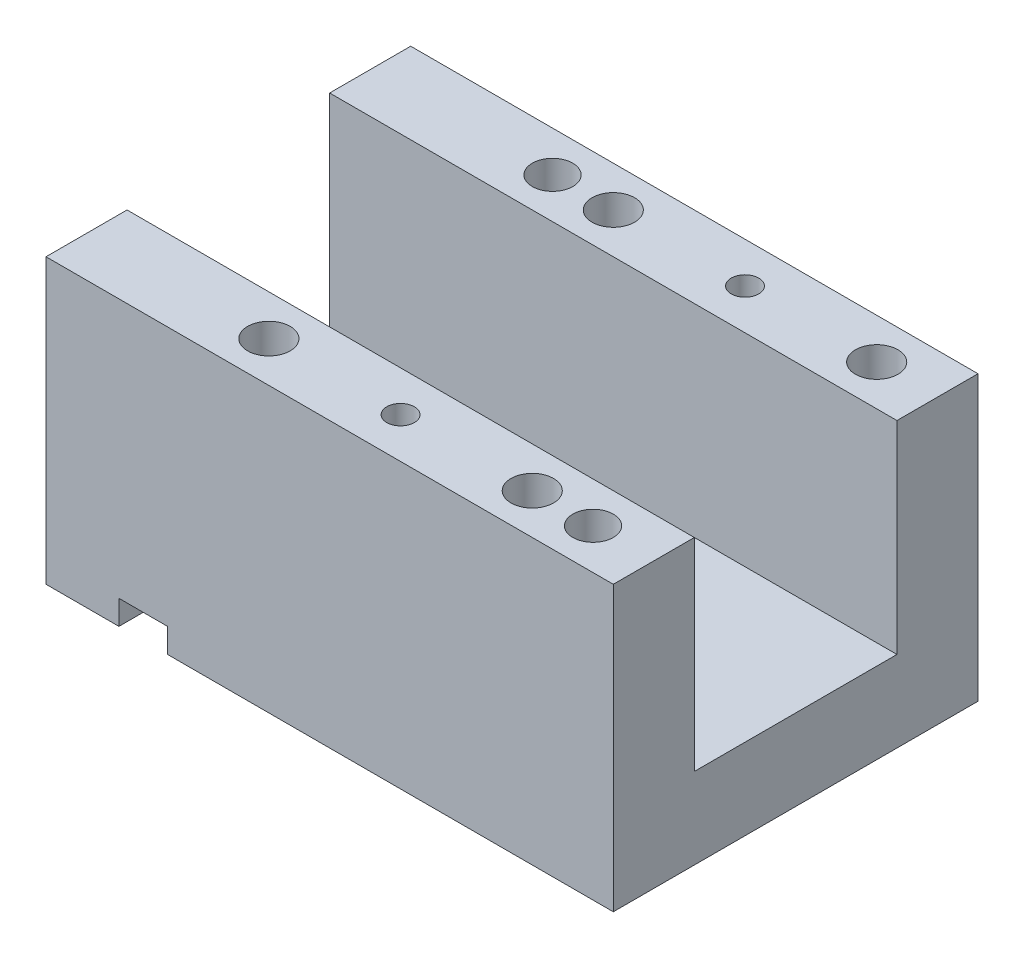
ISO-10303-21;
HEADER;
FILE_DESCRIPTION(('STEP AP214'),'2;1');
FILE_NAME('part.step','',(''),(''),'','','');
FILE_SCHEMA(('AUTOMOTIVE_DESIGN { 1 0 10303 214 1 1 1 1 }'));
ENDSEC;
DATA;
#1=APPLICATION_CONTEXT('core data for automotive mechanical design processes');
#2=APPLICATION_PROTOCOL_DEFINITION('international standard','automotive_design',2000,#1);
#3=PRODUCT_CONTEXT('',#1,'mechanical');
#4=PRODUCT('Part','Part','',(#3));
#5=PRODUCT_RELATED_PRODUCT_CATEGORY('part','',(#4));
#6=PRODUCT_DEFINITION_FORMATION('','',#4);
#7=PRODUCT_DEFINITION_CONTEXT('part definition',#1,'design');
#8=PRODUCT_DEFINITION('design','',#6,#7);
#9=PRODUCT_DEFINITION_SHAPE('','',#8);
#10=(LENGTH_UNIT() NAMED_UNIT(*) SI_UNIT(.MILLI.,.METRE.));
#11=(NAMED_UNIT(*) PLANE_ANGLE_UNIT() SI_UNIT($,.RADIAN.));
#12=(NAMED_UNIT(*) SI_UNIT($,.STERADIAN.) SOLID_ANGLE_UNIT());
#13=UNCERTAINTY_MEASURE_WITH_UNIT(LENGTH_MEASURE(1.E-05),#10,'distance_accuracy_value','');
#14=(GEOMETRIC_REPRESENTATION_CONTEXT(3) GLOBAL_UNCERTAINTY_ASSIGNED_CONTEXT((#13)) GLOBAL_UNIT_ASSIGNED_CONTEXT((#10,
#11,#12)) REPRESENTATION_CONTEXT('',''));
#15=CARTESIAN_POINT('',(0.,0.,0.));
#16=DIRECTION('',(0.,0.,1.));
#17=DIRECTION('',(1.,0.,0.));
#18=AXIS2_PLACEMENT_3D('',#15,#16,#17);
#19=CARTESIAN_POINT('',(-70.,-35.,45.));
#20=DIRECTION('',(0.,1.,0.));
#21=DIRECTION('',(0.,0.,1.));
#22=AXIS2_PLACEMENT_3D('',#19,#20,#21);
#23=PLANE('',#22);
#24=DIRECTION('',(1.,0.,0.));
#25=VECTOR('',#24,1.);
#26=CARTESIAN_POINT('',(-70.,-35.,-45.));
#27=LINE('',#26,#25);
#28=CARTESIAN_POINT('',(-70.,-35.,-45.));
#29=VERTEX_POINT('',#28);
#30=CARTESIAN_POINT('',(-52.,-35.,-45.));
#31=VERTEX_POINT('',#30);
#32=EDGE_CURVE('E283',#29,#31,#27,.T.);
#33=ORIENTED_EDGE('',*,*,#32,.T.);
#34=DIRECTION('',(0.,0.,1.));
#35=VECTOR('',#34,1.);
#36=CARTESIAN_POINT('',(-52.,-35.,-45.));
#37=LINE('',#36,#35);
#38=CARTESIAN_POINT('',(-52.,-35.,45.));
#39=VERTEX_POINT('',#38);
#40=EDGE_CURVE('E228',#31,#39,#37,.T.);
#41=ORIENTED_EDGE('',*,*,#40,.T.);
#42=DIRECTION('',(1.,0.,0.));
#43=VECTOR('',#42,1.);
#44=CARTESIAN_POINT('',(-70.,-35.,45.));
#45=LINE('',#44,#43);
#46=CARTESIAN_POINT('',(-70.,-35.,45.));
#47=VERTEX_POINT('',#46);
#48=EDGE_CURVE('E288',#47,#39,#45,.T.);
#49=ORIENTED_EDGE('',*,*,#48,.F.);
#50=DIRECTION('',(0.,0.,-1.));
#51=VECTOR('',#50,1.);
#52=CARTESIAN_POINT('',(-70.,-35.,45.));
#53=LINE('',#52,#51);
#54=EDGE_CURVE('E304',#47,#29,#53,.T.);
#55=ORIENTED_EDGE('',*,*,#54,.T.);
#56=EDGE_LOOP('',(#33,#41,#49,#55));
#57=FACE_BOUND('',#56,.T.);
#58=ADVANCED_FACE('F51',(#57),#23,.F.);
#59=CARTESIAN_POINT('',(70.,-35.,45.));
#60=DIRECTION('',(-1.,0.,0.));
#61=DIRECTION('',(0.,0.,1.));
#62=AXIS2_PLACEMENT_3D('',#59,#60,#61);
#63=PLANE('',#62);
#64=DIRECTION('',(0.,-1.,0.));
#65=VECTOR('',#64,1.);
#66=CARTESIAN_POINT('',(70.,35.000012,25.));
#67=LINE('',#66,#65);
#68=CARTESIAN_POINT('',(70.,35.,25.));
#69=VERTEX_POINT('',#68);
#70=CARTESIAN_POINT('',(70.,-15.,25.));
#71=VERTEX_POINT('',#70);
#72=EDGE_CURVE('E272',#69,#71,#67,.T.);
#73=ORIENTED_EDGE('',*,*,#72,.F.);
#74=DIRECTION('',(0.,0.,-1.));
#75=VECTOR('',#74,1.);
#76=CARTESIAN_POINT('',(70.,35.,45.));
#77=LINE('',#76,#75);
#78=CARTESIAN_POINT('',(70.,35.,45.));
#79=VERTEX_POINT('',#78);
#80=EDGE_CURVE('E312',#79,#69,#77,.T.);
#81=ORIENTED_EDGE('',*,*,#80,.F.);
#82=DIRECTION('',(0.,1.,0.));
#83=VECTOR('',#82,1.);
#84=CARTESIAN_POINT('',(70.,-35.,45.));
#85=LINE('',#84,#83);
#86=CARTESIAN_POINT('',(70.,-35.,45.));
#87=VERTEX_POINT('',#86);
#88=EDGE_CURVE('E279',#87,#79,#85,.T.);
#89=ORIENTED_EDGE('',*,*,#88,.F.);
#90=DIRECTION('',(0.,0.,-1.));
#91=VECTOR('',#90,1.);
#92=CARTESIAN_POINT('',(70.,-35.,45.));
#93=LINE('',#92,#91);
#94=CARTESIAN_POINT('',(70.,-35.,-45.));
#95=VERTEX_POINT('',#94);
#96=EDGE_CURVE('E291',#87,#95,#93,.T.);
#97=ORIENTED_EDGE('',*,*,#96,.T.);
#98=DIRECTION('',(0.,1.,0.));
#99=VECTOR('',#98,1.);
#100=CARTESIAN_POINT('',(70.,-35.,-45.));
#101=LINE('',#100,#99);
#102=CARTESIAN_POINT('',(70.,35.,-45.));
#103=VERTEX_POINT('',#102);
#104=EDGE_CURVE('E278',#95,#103,#101,.T.);
#105=ORIENTED_EDGE('',*,*,#104,.T.);
#106=CARTESIAN_POINT('',(70.,35.,-25.));
#107=VERTEX_POINT('',#106);
#108=EDGE_CURVE('E311',#107,#103,#77,.T.);
#109=ORIENTED_EDGE('',*,*,#108,.F.);
#110=DIRECTION('',(0.,-1.,0.));
#111=VECTOR('',#110,1.);
#112=CARTESIAN_POINT('',(70.,35.000012,-25.));
#113=LINE('',#112,#111);
#114=CARTESIAN_POINT('',(70.,-15.,-25.));
#115=VERTEX_POINT('',#114);
#116=EDGE_CURVE('E269',#107,#115,#113,.T.);
#117=ORIENTED_EDGE('',*,*,#116,.T.);
#118=DIRECTION('',(0.,0.,-1.));
#119=VECTOR('',#118,1.);
#120=CARTESIAN_POINT('',(70.,-15.,-25.));
#121=LINE('',#120,#119);
#122=EDGE_CURVE('E266',#71,#115,#121,.T.);
#123=ORIENTED_EDGE('',*,*,#122,.F.);
#124=EDGE_LOOP('',(#73,#81,#89,#97,#105,#109,#117,#123));
#125=FACE_BOUND('',#124,.T.);
#126=ADVANCED_FACE('F53',(#125),#63,.F.);
#127=CARTESIAN_POINT('',(-70.,35.,45.));
#128=DIRECTION('',(0.,-1.,0.));
#129=DIRECTION('',(0.,0.,-1.));
#130=AXIS2_PLACEMENT_3D('',#127,#128,#129);
#131=PLANE('',#130);
#132=CARTESIAN_POINT('',(7.49999999999998,35.,35.));
#133=DIRECTION('',(0.,1.,0.));
#134=DIRECTION('',(0.,0.,1.));
#135=AXIS2_PLACEMENT_3D('',#132,#133,#134);
#136=CIRCLE('',#135,3.39999999999999);
#137=CARTESIAN_POINT('',(7.49999999999998,35.,38.4));
#138=VERTEX_POINT('',#137);
#139=EDGE_CURVE('E195',#138,#138,#136,.T.);
#140=ORIENTED_EDGE('',*,*,#139,.F.);
#141=EDGE_LOOP('',(#140));
#142=FACE_BOUND('',#141,.T.);
#143=CARTESIAN_POINT('',(55.,35.,35.));
#144=DIRECTION('',(0.,1.,0.));
#145=DIRECTION('',(0.,0.,1.));
#146=AXIS2_PLACEMENT_3D('',#143,#144,#145);
#147=CIRCLE('',#146,5.);
#148=CARTESIAN_POINT('',(55.,35.,40.));
#149=VERTEX_POINT('',#148);
#150=EDGE_CURVE('E201',#149,#149,#147,.T.);
#151=ORIENTED_EDGE('',*,*,#150,.F.);
#152=EDGE_LOOP('',(#151));
#153=FACE_BOUND('',#152,.T.);
#154=CARTESIAN_POINT('',(40.,35.,35.));
#155=DIRECTION('',(0.,1.,0.));
#156=DIRECTION('',(0.,0.,1.));
#157=AXIS2_PLACEMENT_3D('',#154,#155,#156);
#158=CIRCLE('',#157,5.24999999999999);
#159=CARTESIAN_POINT('',(40.,35.,40.25));
#160=VERTEX_POINT('',#159);
#161=EDGE_CURVE('E243',#160,#160,#158,.T.);
#162=ORIENTED_EDGE('',*,*,#161,.F.);
#163=EDGE_LOOP('',(#162));
#164=FACE_BOUND('',#163,.T.);
#165=CARTESIAN_POINT('',(-25.,35.,35.));
#166=DIRECTION('',(0.,1.,0.));
#167=DIRECTION('',(0.,0.,1.));
#168=AXIS2_PLACEMENT_3D('',#165,#166,#167);
#169=CIRCLE('',#168,5.24999999999999);
#170=CARTESIAN_POINT('',(-25.,35.,40.25));
#171=VERTEX_POINT('',#170);
#172=EDGE_CURVE('E249',#171,#171,#169,.T.);
#173=ORIENTED_EDGE('',*,*,#172,.F.);
#174=EDGE_LOOP('',(#173));
#175=FACE_BOUND('',#174,.T.);
#176=DIRECTION('',(1.,0.,0.));
#177=VECTOR('',#176,1.);
#178=CARTESIAN_POINT('',(-70.,35.,25.));
#179=LINE('',#178,#177);
#180=CARTESIAN_POINT('',(-70.,35.,25.));
#181=VERTEX_POINT('',#180);
#182=EDGE_CURVE('E276',#181,#69,#179,.T.);
#183=ORIENTED_EDGE('',*,*,#182,.F.);
#184=DIRECTION('',(0.,0.,-1.));
#185=VECTOR('',#184,1.);
#186=CARTESIAN_POINT('',(-70.,35.,45.));
#187=LINE('',#186,#185);
#188=CARTESIAN_POINT('',(-70.,35.,45.));
#189=VERTEX_POINT('',#188);
#190=EDGE_CURVE('E308',#189,#181,#187,.T.);
#191=ORIENTED_EDGE('',*,*,#190,.F.);
#192=DIRECTION('',(-1.,0.,0.));
#193=VECTOR('',#192,1.);
#194=CARTESIAN_POINT('',(-70.,35.,45.));
#195=LINE('',#194,#193);
#196=EDGE_CURVE('E282',#79,#189,#195,.T.);
#197=ORIENTED_EDGE('',*,*,#196,.F.);
#198=ORIENTED_EDGE('',*,*,#80,.T.);
#199=EDGE_LOOP('',(#183,#191,#197,#198));
#200=FACE_BOUND('',#199,.T.);
#201=ADVANCED_FACE('F351',(#142,#153,#164,#175,#200),#131,.F.);
#202=CARTESIAN_POINT('',(22.5,35.,-35.));
#203=DIRECTION('',(0.,1.,0.));
#204=DIRECTION('',(0.,0.,1.));
#205=AXIS2_PLACEMENT_3D('',#202,#203,#204);
#206=CIRCLE('',#205,3.39999999999999);
#207=CARTESIAN_POINT('',(22.5,35.,-31.6));
#208=VERTEX_POINT('',#207);
#209=EDGE_CURVE('E189',#208,#208,#206,.T.);
#210=ORIENTED_EDGE('',*,*,#209,.F.);
#211=EDGE_LOOP('',(#210));
#212=FACE_BOUND('',#211,.T.);
#213=CARTESIAN_POINT('',(-25.,35.,-35.));
#214=DIRECTION('',(0.,1.,0.));
#215=DIRECTION('',(0.,0.,1.));
#216=AXIS2_PLACEMENT_3D('',#213,#214,#215);
#217=CIRCLE('',#216,5.);
#218=CARTESIAN_POINT('',(-25.,35.,-30.));
#219=VERTEX_POINT('',#218);
#220=EDGE_CURVE('E207',#219,#219,#217,.T.);
#221=ORIENTED_EDGE('',*,*,#220,.F.);
#222=EDGE_LOOP('',(#221));
#223=FACE_BOUND('',#222,.T.);
#224=CARTESIAN_POINT('',(55.,35.,-35.));
#225=DIRECTION('',(0.,1.,0.));
#226=DIRECTION('',(0.,0.,1.));
#227=AXIS2_PLACEMENT_3D('',#224,#225,#226);
#228=CIRCLE('',#227,5.24999999999999);
#229=CARTESIAN_POINT('',(55.,35.,-29.75));
#230=VERTEX_POINT('',#229);
#231=EDGE_CURVE('E231',#230,#230,#228,.T.);
#232=ORIENTED_EDGE('',*,*,#231,.F.);
#233=EDGE_LOOP('',(#232));
#234=FACE_BOUND('',#233,.T.);
#235=CARTESIAN_POINT('',(-10.,35.,-35.));
#236=DIRECTION('',(0.,1.,0.));
#237=DIRECTION('',(0.,0.,1.));
#238=AXIS2_PLACEMENT_3D('',#235,#236,#237);
#239=CIRCLE('',#238,5.24999999999999);
#240=CARTESIAN_POINT('',(-10.,35.,-29.75));
#241=VERTEX_POINT('',#240);
#242=EDGE_CURVE('E255',#241,#241,#239,.T.);
#243=ORIENTED_EDGE('',*,*,#242,.F.);
#244=EDGE_LOOP('',(#243));
#245=FACE_BOUND('',#244,.T.);
#246=DIRECTION('',(-1.,0.,0.));
#247=VECTOR('',#246,1.);
#248=CARTESIAN_POINT('',(-70.,35.,-25.));
#249=LINE('',#248,#247);
#250=CARTESIAN_POINT('',(-70.,35.,-25.));
#251=VERTEX_POINT('',#250);
#252=EDGE_CURVE('E274',#107,#251,#249,.T.);
#253=ORIENTED_EDGE('',*,*,#252,.F.);
#254=ORIENTED_EDGE('',*,*,#108,.T.);
#255=DIRECTION('',(-1.,0.,0.));
#256=VECTOR('',#255,1.);
#257=CARTESIAN_POINT('',(-70.,35.,-45.));
#258=LINE('',#257,#256);
#259=CARTESIAN_POINT('',(-70.,35.,-45.));
#260=VERTEX_POINT('',#259);
#261=EDGE_CURVE('E294',#103,#260,#258,.T.);
#262=ORIENTED_EDGE('',*,*,#261,.T.);
#263=EDGE_CURVE('E307',#251,#260,#187,.T.);
#264=ORIENTED_EDGE('',*,*,#263,.F.);
#265=EDGE_LOOP('',(#253,#254,#262,#264));
#266=FACE_BOUND('',#265,.T.);
#267=ADVANCED_FACE('F331',(#212,#223,#234,#245,#266),#131,.F.);
#268=CARTESIAN_POINT('',(-70.,-35.,45.));
#269=DIRECTION('',(1.,0.,0.));
#270=DIRECTION('',(0.,0.,-1.));
#271=AXIS2_PLACEMENT_3D('',#268,#269,#270);
#272=PLANE('',#271);
#273=CARTESIAN_POINT('',(-70.,23.,-35.));
#274=DIRECTION('',(-1.,0.,0.));
#275=DIRECTION('',(0.,0.,1.));
#276=AXIS2_PLACEMENT_3D('',#273,#274,#275);
#277=CIRCLE('',#276,3.39999999999999);
#278=CARTESIAN_POINT('',(-70.,23.,-31.6));
#279=VERTEX_POINT('',#278);
#280=EDGE_CURVE('E167',#279,#279,#277,.T.);
#281=ORIENTED_EDGE('',*,*,#280,.F.);
#282=EDGE_LOOP('',(#281));
#283=FACE_BOUND('',#282,.T.);
#284=CARTESIAN_POINT('',(-70.,-23.,-35.));
#285=DIRECTION('',(-1.,0.,0.));
#286=DIRECTION('',(0.,0.,1.));
#287=AXIS2_PLACEMENT_3D('',#284,#285,#286);
#288=CIRCLE('',#287,3.39999999999999);
#289=CARTESIAN_POINT('',(-70.,-23.,-31.6));
#290=VERTEX_POINT('',#289);
#291=EDGE_CURVE('E166',#290,#290,#288,.T.);
#292=ORIENTED_EDGE('',*,*,#291,.F.);
#293=EDGE_LOOP('',(#292));
#294=FACE_BOUND('',#293,.T.);
#295=CARTESIAN_POINT('',(-70.,23.,35.));
#296=DIRECTION('',(-1.,0.,0.));
#297=DIRECTION('',(0.,0.,1.));
#298=AXIS2_PLACEMENT_3D('',#295,#296,#297);
#299=CIRCLE('',#298,3.39999999999999);
#300=CARTESIAN_POINT('',(-70.,23.,38.4));
#301=VERTEX_POINT('',#300);
#302=EDGE_CURVE('E177',#301,#301,#299,.T.);
#303=ORIENTED_EDGE('',*,*,#302,.F.);
#304=EDGE_LOOP('',(#303));
#305=FACE_BOUND('',#304,.T.);
#306=CARTESIAN_POINT('',(-70.,-23.,35.));
#307=DIRECTION('',(-1.,0.,0.));
#308=DIRECTION('',(0.,0.,1.));
#309=AXIS2_PLACEMENT_3D('',#306,#307,#308);
#310=CIRCLE('',#309,3.39999999999999);
#311=CARTESIAN_POINT('',(-70.,-23.,38.4));
#312=VERTEX_POINT('',#311);
#313=EDGE_CURVE('E183',#312,#312,#310,.T.);
#314=ORIENTED_EDGE('',*,*,#313,.F.);
#315=EDGE_LOOP('',(#314));
#316=FACE_BOUND('',#315,.T.);
#317=DIRECTION('',(0.,1.,0.));
#318=VECTOR('',#317,1.);
#319=CARTESIAN_POINT('',(-70.,-35.,25.));
#320=LINE('',#319,#318);
#321=CARTESIAN_POINT('',(-70.,-15.,25.));
#322=VERTEX_POINT('',#321);
#323=EDGE_CURVE('E11',#322,#181,#320,.T.);
#324=ORIENTED_EDGE('',*,*,#323,.F.);
#325=DIRECTION('',(0.,0.,1.));
#326=VECTOR('',#325,1.);
#327=CARTESIAN_POINT('',(-70.,-15.,-25.));
#328=LINE('',#327,#326);
#329=CARTESIAN_POINT('',(-70.,-15.,-25.));
#330=VERTEX_POINT('',#329);
#331=EDGE_CURVE('E261',#330,#322,#328,.T.);
#332=ORIENTED_EDGE('',*,*,#331,.F.);
#333=DIRECTION('',(0.,-1.,0.));
#334=VECTOR('',#333,1.);
#335=CARTESIAN_POINT('',(-70.,-35.,-25.));
#336=LINE('',#335,#334);
#337=EDGE_CURVE('E59',#251,#330,#336,.T.);
#338=ORIENTED_EDGE('',*,*,#337,.F.);
#339=ORIENTED_EDGE('',*,*,#263,.T.);
#340=DIRECTION('',(0.,-1.,0.));
#341=VECTOR('',#340,1.);
#342=CARTESIAN_POINT('',(-70.,-35.,-45.));
#343=LINE('',#342,#341);
#344=EDGE_CURVE('E297',#260,#29,#343,.T.);
#345=ORIENTED_EDGE('',*,*,#344,.T.);
#346=ORIENTED_EDGE('',*,*,#54,.F.);
#347=DIRECTION('',(0.,-1.,0.));
#348=VECTOR('',#347,1.);
#349=CARTESIAN_POINT('',(-70.,-35.,45.));
#350=LINE('',#349,#348);
#351=EDGE_CURVE('E285',#189,#47,#350,.T.);
#352=ORIENTED_EDGE('',*,*,#351,.F.);
#353=ORIENTED_EDGE('',*,*,#190,.T.);
#354=EDGE_LOOP('',(#324,#332,#338,#339,#345,#346,#352,#353));
#355=FACE_BOUND('',#354,.T.);
#356=ADVANCED_FACE('F322',(#283,#294,#305,#316,#355),#272,.F.);
#357=CARTESIAN_POINT('',(55.,-35.,35.));
#358=DIRECTION('',(0.,1.,0.));
#359=DIRECTION('',(0.,0.,1.));
#360=AXIS2_PLACEMENT_3D('',#357,#358,#359);
#361=CIRCLE('',#360,4.99999999999999);
#362=CARTESIAN_POINT('',(55.,-35.,40.));
#363=VERTEX_POINT('',#362);
#364=EDGE_CURVE('E204',#363,#363,#361,.T.);
#365=ORIENTED_EDGE('',*,*,#364,.T.);
#366=EDGE_LOOP('',(#365));
#367=FACE_BOUND('',#366,.T.);
#368=CARTESIAN_POINT('',(-25.,-35.,-35.));
#369=DIRECTION('',(0.,1.,0.));
#370=DIRECTION('',(0.,0.,1.));
#371=AXIS2_PLACEMENT_3D('',#368,#369,#370);
#372=CIRCLE('',#371,4.99999999999999);
#373=CARTESIAN_POINT('',(-25.,-35.,-30.));
#374=VERTEX_POINT('',#373);
#375=EDGE_CURVE('E210',#374,#374,#372,.T.);
#376=ORIENTED_EDGE('',*,*,#375,.T.);
#377=EDGE_LOOP('',(#376));
#378=FACE_BOUND('',#377,.T.);
#379=CARTESIAN_POINT('',(55.,-35.,-35.));
#380=DIRECTION('',(0.,1.,0.));
#381=DIRECTION('',(0.,0.,1.));
#382=AXIS2_PLACEMENT_3D('',#379,#380,#381);
#383=CIRCLE('',#382,5.24999999999999);
#384=CARTESIAN_POINT('',(55.,-35.,-29.75));
#385=VERTEX_POINT('',#384);
#386=EDGE_CURVE('E240',#385,#385,#383,.T.);
#387=ORIENTED_EDGE('',*,*,#386,.T.);
#388=EDGE_LOOP('',(#387));
#389=FACE_BOUND('',#388,.T.);
#390=CARTESIAN_POINT('',(40.,-35.,35.));
#391=DIRECTION('',(0.,1.,0.));
#392=DIRECTION('',(0.,0.,1.));
#393=AXIS2_PLACEMENT_3D('',#390,#391,#392);
#394=CIRCLE('',#393,5.24999999999999);
#395=CARTESIAN_POINT('',(40.,-35.,40.25));
#396=VERTEX_POINT('',#395);
#397=EDGE_CURVE('E246',#396,#396,#394,.T.);
#398=ORIENTED_EDGE('',*,*,#397,.T.);
#399=EDGE_LOOP('',(#398));
#400=FACE_BOUND('',#399,.T.);
#401=CARTESIAN_POINT('',(-25.,-35.,35.));
#402=DIRECTION('',(0.,1.,0.));
#403=DIRECTION('',(0.,0.,1.));
#404=AXIS2_PLACEMENT_3D('',#401,#402,#403);
#405=CIRCLE('',#404,5.24999999999999);
#406=CARTESIAN_POINT('',(-25.,-35.,40.25));
#407=VERTEX_POINT('',#406);
#408=EDGE_CURVE('E252',#407,#407,#405,.T.);
#409=ORIENTED_EDGE('',*,*,#408,.T.);
#410=EDGE_LOOP('',(#409));
#411=FACE_BOUND('',#410,.T.);
#412=CARTESIAN_POINT('',(-10.,-35.,-35.));
#413=DIRECTION('',(0.,1.,0.));
#414=DIRECTION('',(0.,0.,1.));
#415=AXIS2_PLACEMENT_3D('',#412,#413,#414);
#416=CIRCLE('',#415,5.24999999999999);
#417=CARTESIAN_POINT('',(-10.,-35.,-29.75));
#418=VERTEX_POINT('',#417);
#419=EDGE_CURVE('E258',#418,#418,#416,.T.);
#420=ORIENTED_EDGE('',*,*,#419,.T.);
#421=EDGE_LOOP('',(#420));
#422=FACE_BOUND('',#421,.T.);
#423=CARTESIAN_POINT('',(-40.,-35.,45.));
#424=VERTEX_POINT('',#423);
#425=EDGE_CURVE('E287',#424,#87,#45,.T.);
#426=ORIENTED_EDGE('',*,*,#425,.F.);
#427=DIRECTION('',(0.,0.,1.));
#428=VECTOR('',#427,1.);
#429=CARTESIAN_POINT('',(-40.,-35.,-45.));
#430=LINE('',#429,#428);
#431=CARTESIAN_POINT('',(-40.,-35.,-45.));
#432=VERTEX_POINT('',#431);
#433=EDGE_CURVE('E234',#432,#424,#430,.T.);
#434=ORIENTED_EDGE('',*,*,#433,.F.);
#435=EDGE_CURVE('E299',#432,#95,#27,.T.);
#436=ORIENTED_EDGE('',*,*,#435,.T.);
#437=ORIENTED_EDGE('',*,*,#96,.F.);
#438=EDGE_LOOP('',(#426,#434,#436,#437));
#439=FACE_BOUND('',#438,.T.);
#440=ADVANCED_FACE('F365',(#367,#378,#389,#400,#411,#422,#439),#23,.F.);
#441=CARTESIAN_POINT('',(0.,0.,45.));
#442=DIRECTION('',(0.,0.,-1.));
#443=DIRECTION('',(-1.,0.,0.));
#444=AXIS2_PLACEMENT_3D('',#441,#442,#443);
#445=PLANE('',#444);
#446=ORIENTED_EDGE('',*,*,#48,.T.);
#447=DIRECTION('',(0.,-1.,0.));
#448=VECTOR('',#447,1.);
#449=CARTESIAN_POINT('',(-52.,-35.,45.));
#450=LINE('',#449,#448);
#451=CARTESIAN_POINT('',(-52.,-29.,45.));
#452=VERTEX_POINT('',#451);
#453=EDGE_CURVE('E213',#452,#39,#450,.T.);
#454=ORIENTED_EDGE('',*,*,#453,.F.);
#455=DIRECTION('',(-1.,0.,0.));
#456=VECTOR('',#455,1.);
#457=CARTESIAN_POINT('',(-52.,-29.,45.));
#458=LINE('',#457,#456);
#459=CARTESIAN_POINT('',(-40.,-29.,45.));
#460=VERTEX_POINT('',#459);
#461=EDGE_CURVE('E218',#460,#452,#458,.T.);
#462=ORIENTED_EDGE('',*,*,#461,.F.);
#463=DIRECTION('',(0.,1.,0.));
#464=VECTOR('',#463,1.);
#465=CARTESIAN_POINT('',(-40.,-35.,45.));
#466=LINE('',#465,#464);
#467=EDGE_CURVE('E215',#424,#460,#466,.T.);
#468=ORIENTED_EDGE('',*,*,#467,.F.);
#469=ORIENTED_EDGE('',*,*,#425,.T.);
#470=ORIENTED_EDGE('',*,*,#88,.T.);
#471=ORIENTED_EDGE('',*,*,#196,.T.);
#472=ORIENTED_EDGE('',*,*,#351,.T.);
#473=EDGE_LOOP('',(#446,#454,#462,#468,#469,#470,#471,#472));
#474=FACE_BOUND('',#473,.T.);
#475=ADVANCED_FACE('F346',(#474),#445,.F.);
#476=CARTESIAN_POINT('',(0.,0.,-45.));
#477=DIRECTION('',(0.,0.,-1.));
#478=DIRECTION('',(-1.,0.,0.));
#479=AXIS2_PLACEMENT_3D('',#476,#477,#478);
#480=PLANE('',#479);
#481=DIRECTION('',(0.,-1.,0.));
#482=VECTOR('',#481,1.);
#483=CARTESIAN_POINT('',(-52.,-35.,-45.));
#484=LINE('',#483,#482);
#485=CARTESIAN_POINT('',(-52.,-29.,-45.));
#486=VERTEX_POINT('',#485);
#487=EDGE_CURVE('E221',#486,#31,#484,.T.);
#488=ORIENTED_EDGE('',*,*,#487,.T.);
#489=ORIENTED_EDGE('',*,*,#32,.F.);
#490=ORIENTED_EDGE('',*,*,#344,.F.);
#491=ORIENTED_EDGE('',*,*,#261,.F.);
#492=ORIENTED_EDGE('',*,*,#104,.F.);
#493=ORIENTED_EDGE('',*,*,#435,.F.);
#494=DIRECTION('',(0.,1.,0.));
#495=VECTOR('',#494,1.);
#496=CARTESIAN_POINT('',(-40.,-35.,-45.));
#497=LINE('',#496,#495);
#498=CARTESIAN_POINT('',(-40.,-29.,-45.));
#499=VERTEX_POINT('',#498);
#500=EDGE_CURVE('E224',#432,#499,#497,.T.);
#501=ORIENTED_EDGE('',*,*,#500,.T.);
#502=DIRECTION('',(-1.,0.,0.));
#503=VECTOR('',#502,1.);
#504=CARTESIAN_POINT('',(-52.,-29.,-45.));
#505=LINE('',#504,#503);
#506=EDGE_CURVE('E66',#499,#486,#505,.T.);
#507=ORIENTED_EDGE('',*,*,#506,.T.);
#508=EDGE_LOOP('',(#488,#489,#490,#491,#492,#493,#501,#507));
#509=FACE_BOUND('',#508,.T.);
#510=ADVANCED_FACE('F340',(#509),#480,.T.);
#511=CARTESIAN_POINT('',(-70.,35.000012,25.));
#512=DIRECTION('',(0.,0.,-1.));
#513=DIRECTION('',(-1.,0.,0.));
#514=AXIS2_PLACEMENT_3D('',#511,#512,#513);
#515=PLANE('',#514);
#516=ORIENTED_EDGE('',*,*,#182,.T.);
#517=ORIENTED_EDGE('',*,*,#72,.T.);
#518=DIRECTION('',(1.,0.,0.));
#519=VECTOR('',#518,1.);
#520=CARTESIAN_POINT('',(-70.,-15.,25.));
#521=LINE('',#520,#519);
#522=EDGE_CURVE('E263',#322,#71,#521,.T.);
#523=ORIENTED_EDGE('',*,*,#522,.F.);
#524=ORIENTED_EDGE('',*,*,#323,.T.);
#525=EDGE_LOOP('',(#516,#517,#523,#524));
#526=FACE_BOUND('',#525,.T.);
#527=ADVANCED_FACE('F352',(#526),#515,.T.);
#528=CARTESIAN_POINT('',(-70.,35.000012,-25.));
#529=DIRECTION('',(0.,0.,1.));
#530=DIRECTION('',(1.,0.,0.));
#531=AXIS2_PLACEMENT_3D('',#528,#529,#530);
#532=PLANE('',#531);
#533=ORIENTED_EDGE('',*,*,#252,.T.);
#534=ORIENTED_EDGE('',*,*,#337,.T.);
#535=DIRECTION('',(-1.,0.,0.));
#536=VECTOR('',#535,1.);
#537=CARTESIAN_POINT('',(-70.,-15.,-25.));
#538=LINE('',#537,#536);
#539=EDGE_CURVE('E74',#115,#330,#538,.T.);
#540=ORIENTED_EDGE('',*,*,#539,.F.);
#541=ORIENTED_EDGE('',*,*,#116,.F.);
#542=EDGE_LOOP('',(#533,#534,#540,#541));
#543=FACE_BOUND('',#542,.T.);
#544=ADVANCED_FACE('F317',(#543),#532,.T.);
#545=CARTESIAN_POINT('',(0.,-15.,0.));
#546=DIRECTION('',(0.,1.,0.));
#547=DIRECTION('',(0.,0.,1.));
#548=AXIS2_PLACEMENT_3D('',#545,#546,#547);
#549=PLANE('',#548);
#550=ORIENTED_EDGE('',*,*,#331,.T.);
#551=ORIENTED_EDGE('',*,*,#522,.T.);
#552=ORIENTED_EDGE('',*,*,#122,.T.);
#553=ORIENTED_EDGE('',*,*,#539,.T.);
#554=EDGE_LOOP('',(#550,#551,#552,#553));
#555=FACE_BOUND('',#554,.T.);
#556=ADVANCED_FACE('F323',(#555),#549,.T.);
#557=CARTESIAN_POINT('',(-10.,35.,-35.));
#558=DIRECTION('',(0.,1.,0.));
#559=DIRECTION('',(0.,0.,1.));
#560=AXIS2_PLACEMENT_3D('',#557,#558,#559);
#561=CYLINDRICAL_SURFACE('',#560,5.24999999999999);
#562=ORIENTED_EDGE('',*,*,#419,.F.);
#563=EDGE_LOOP('',(#562));
#564=FACE_BOUND('',#563,.T.);
#565=ORIENTED_EDGE('',*,*,#242,.T.);
#566=EDGE_LOOP('',(#565));
#567=FACE_BOUND('',#566,.T.);
#568=ADVANCED_FACE('F423',(#564,#567),#561,.F.);
#569=CARTESIAN_POINT('',(-25.,35.,35.));
#570=DIRECTION('',(0.,1.,0.));
#571=DIRECTION('',(0.,0.,1.));
#572=AXIS2_PLACEMENT_3D('',#569,#570,#571);
#573=CYLINDRICAL_SURFACE('',#572,5.24999999999999);
#574=ORIENTED_EDGE('',*,*,#408,.F.);
#575=EDGE_LOOP('',(#574));
#576=FACE_BOUND('',#575,.T.);
#577=ORIENTED_EDGE('',*,*,#172,.T.);
#578=EDGE_LOOP('',(#577));
#579=FACE_BOUND('',#578,.T.);
#580=ADVANCED_FACE('F419',(#576,#579),#573,.F.);
#581=CARTESIAN_POINT('',(40.,35.,35.));
#582=DIRECTION('',(0.,1.,0.));
#583=DIRECTION('',(0.,0.,1.));
#584=AXIS2_PLACEMENT_3D('',#581,#582,#583);
#585=CYLINDRICAL_SURFACE('',#584,5.24999999999999);
#586=ORIENTED_EDGE('',*,*,#397,.F.);
#587=EDGE_LOOP('',(#586));
#588=FACE_BOUND('',#587,.T.);
#589=ORIENTED_EDGE('',*,*,#161,.T.);
#590=EDGE_LOOP('',(#589));
#591=FACE_BOUND('',#590,.T.);
#592=ADVANCED_FACE('F415',(#588,#591),#585,.F.);
#593=CARTESIAN_POINT('',(55.,35.,-35.));
#594=DIRECTION('',(0.,1.,0.));
#595=DIRECTION('',(0.,0.,1.));
#596=AXIS2_PLACEMENT_3D('',#593,#594,#595);
#597=CYLINDRICAL_SURFACE('',#596,5.24999999999999);
#598=ORIENTED_EDGE('',*,*,#386,.F.);
#599=EDGE_LOOP('',(#598));
#600=FACE_BOUND('',#599,.T.);
#601=ORIENTED_EDGE('',*,*,#231,.T.);
#602=EDGE_LOOP('',(#601));
#603=FACE_BOUND('',#602,.T.);
#604=ADVANCED_FACE('F408',(#600,#603),#597,.F.);
#605=CARTESIAN_POINT('',(-52.,-35.,-45.));
#606=DIRECTION('',(-1.,0.,0.));
#607=DIRECTION('',(0.,0.,1.));
#608=AXIS2_PLACEMENT_3D('',#605,#606,#607);
#609=PLANE('',#608);
#610=ORIENTED_EDGE('',*,*,#40,.F.);
#611=ORIENTED_EDGE('',*,*,#487,.F.);
#612=DIRECTION('',(0.,0.,1.));
#613=VECTOR('',#612,1.);
#614=CARTESIAN_POINT('',(-52.,-29.,-45.));
#615=LINE('',#614,#613);
#616=EDGE_CURVE('E229',#486,#452,#615,.T.);
#617=ORIENTED_EDGE('',*,*,#616,.T.);
#618=ORIENTED_EDGE('',*,*,#453,.T.);
#619=EDGE_LOOP('',(#610,#611,#617,#618));
#620=FACE_BOUND('',#619,.T.);
#621=ADVANCED_FACE('F343',(#620),#609,.F.);
#622=CARTESIAN_POINT('',(-52.,-29.,-45.));
#623=DIRECTION('',(0.,1.,0.));
#624=DIRECTION('',(0.,0.,1.));
#625=AXIS2_PLACEMENT_3D('',#622,#623,#624);
#626=PLANE('',#625);
#627=ORIENTED_EDGE('',*,*,#616,.F.);
#628=ORIENTED_EDGE('',*,*,#506,.F.);
#629=DIRECTION('',(0.,0.,1.));
#630=VECTOR('',#629,1.);
#631=CARTESIAN_POINT('',(-40.,-29.,-45.));
#632=LINE('',#631,#630);
#633=EDGE_CURVE('E232',#499,#460,#632,.T.);
#634=ORIENTED_EDGE('',*,*,#633,.T.);
#635=ORIENTED_EDGE('',*,*,#461,.T.);
#636=EDGE_LOOP('',(#627,#628,#634,#635));
#637=FACE_BOUND('',#636,.T.);
#638=ADVANCED_FACE('F400',(#637),#626,.F.);
#639=CARTESIAN_POINT('',(-40.,-35.,-45.));
#640=DIRECTION('',(1.,0.,0.));
#641=DIRECTION('',(0.,0.,-1.));
#642=AXIS2_PLACEMENT_3D('',#639,#640,#641);
#643=PLANE('',#642);
#644=ORIENTED_EDGE('',*,*,#633,.F.);
#645=ORIENTED_EDGE('',*,*,#500,.F.);
#646=ORIENTED_EDGE('',*,*,#433,.T.);
#647=ORIENTED_EDGE('',*,*,#467,.T.);
#648=EDGE_LOOP('',(#644,#645,#646,#647));
#649=FACE_BOUND('',#648,.T.);
#650=ADVANCED_FACE('F398',(#649),#643,.F.);
#651=CARTESIAN_POINT('',(-25.,35.,-35.));
#652=DIRECTION('',(0.,1.,0.));
#653=DIRECTION('',(0.,0.,1.));
#654=AXIS2_PLACEMENT_3D('',#651,#652,#653);
#655=CYLINDRICAL_SURFACE('',#654,4.99999999999999);
#656=ORIENTED_EDGE('',*,*,#375,.F.);
#657=EDGE_LOOP('',(#656));
#658=FACE_BOUND('',#657,.T.);
#659=ORIENTED_EDGE('',*,*,#220,.T.);
#660=EDGE_LOOP('',(#659));
#661=FACE_BOUND('',#660,.T.);
#662=ADVANCED_FACE('F406',(#658,#661),#655,.F.);
#663=CARTESIAN_POINT('',(55.,35.,35.));
#664=DIRECTION('',(0.,1.,0.));
#665=DIRECTION('',(0.,0.,1.));
#666=AXIS2_PLACEMENT_3D('',#663,#664,#665);
#667=CYLINDRICAL_SURFACE('',#666,4.99999999999999);
#668=ORIENTED_EDGE('',*,*,#364,.F.);
#669=EDGE_LOOP('',(#668));
#670=FACE_BOUND('',#669,.T.);
#671=ORIENTED_EDGE('',*,*,#150,.T.);
#672=EDGE_LOOP('',(#671));
#673=FACE_BOUND('',#672,.T.);
#674=ADVANCED_FACE('F614',(#670,#673),#667,.F.);
#675=CARTESIAN_POINT('',(7.49999999999998,17.2929261046937,35.));
#676=DIRECTION('',(0.,1.,0.));
#677=DIRECTION('',(0.,0.,1.));
#678=AXIS2_PLACEMENT_3D('',#675,#676,#677);
#679=CONICAL_SURFACE('',#678,3.4,1.02974425867665);
#680=CARTESIAN_POINT('',(7.49999999999997,15.25,35.));
#681=VERTEX_POINT('',#680);
#682=VERTEX_LOOP('',#681);
#683=FACE_BOUND('',#682,.T.);
#684=CARTESIAN_POINT('',(7.49999999999998,17.2929261046937,35.));
#685=DIRECTION('',(0.,1.,0.));
#686=DIRECTION('',(0.,0.,1.));
#687=AXIS2_PLACEMENT_3D('',#684,#685,#686);
#688=CIRCLE('',#687,3.4);
#689=CARTESIAN_POINT('',(7.49999999999998,17.2929261046937,38.4));
#690=VERTEX_POINT('',#689);
#691=EDGE_CURVE('E198',#690,#690,#688,.T.);
#692=ORIENTED_EDGE('',*,*,#691,.T.);
#693=EDGE_LOOP('',(#692));
#694=FACE_BOUND('',#693,.T.);
#695=ADVANCED_FACE('F483',(#683,#694),#679,.F.);
#696=CARTESIAN_POINT('',(7.49999999999998,35.,35.));
#697=DIRECTION('',(0.,1.,0.));
#698=DIRECTION('',(0.,0.,1.));
#699=AXIS2_PLACEMENT_3D('',#696,#697,#698);
#700=CYLINDRICAL_SURFACE('',#699,3.39999999999999);
#701=ORIENTED_EDGE('',*,*,#691,.F.);
#702=EDGE_LOOP('',(#701));
#703=FACE_BOUND('',#702,.T.);
#704=ORIENTED_EDGE('',*,*,#139,.T.);
#705=EDGE_LOOP('',(#704));
#706=FACE_BOUND('',#705,.T.);
#707=ADVANCED_FACE('F478',(#703,#706),#700,.F.);
#708=CARTESIAN_POINT('',(22.5,17.2929261046937,-35.));
#709=DIRECTION('',(0.,1.,0.));
#710=DIRECTION('',(0.,0.,1.));
#711=AXIS2_PLACEMENT_3D('',#708,#709,#710);
#712=CONICAL_SURFACE('',#711,3.4,1.02974425867665);
#713=CARTESIAN_POINT('',(22.5,15.25,-35.));
#714=VERTEX_POINT('',#713);
#715=VERTEX_LOOP('',#714);
#716=FACE_BOUND('',#715,.T.);
#717=CARTESIAN_POINT('',(22.5,17.2929261046937,-35.));
#718=DIRECTION('',(0.,1.,0.));
#719=DIRECTION('',(0.,0.,1.));
#720=AXIS2_PLACEMENT_3D('',#717,#718,#719);
#721=CIRCLE('',#720,3.4);
#722=CARTESIAN_POINT('',(22.5,17.2929261046937,-31.6));
#723=VERTEX_POINT('',#722);
#724=EDGE_CURVE('E192',#723,#723,#721,.T.);
#725=ORIENTED_EDGE('',*,*,#724,.T.);
#726=EDGE_LOOP('',(#725));
#727=FACE_BOUND('',#726,.T.);
#728=ADVANCED_FACE('F482',(#716,#727),#712,.F.);
#729=CARTESIAN_POINT('',(22.5,35.,-35.));
#730=DIRECTION('',(0.,1.,0.));
#731=DIRECTION('',(0.,0.,1.));
#732=AXIS2_PLACEMENT_3D('',#729,#730,#731);
#733=CYLINDRICAL_SURFACE('',#732,3.39999999999999);
#734=ORIENTED_EDGE('',*,*,#724,.F.);
#735=EDGE_LOOP('',(#734));
#736=FACE_BOUND('',#735,.T.);
#737=ORIENTED_EDGE('',*,*,#209,.T.);
#738=EDGE_LOOP('',(#737));
#739=FACE_BOUND('',#738,.T.);
#740=ADVANCED_FACE('F491',(#736,#739),#733,.F.);
#741=CARTESIAN_POINT('',(-52.2929261046937,-23.,35.));
#742=DIRECTION('',(-1.,0.,0.));
#743=DIRECTION('',(0.,0.,1.));
#744=AXIS2_PLACEMENT_3D('',#741,#742,#743);
#745=CONICAL_SURFACE('',#744,3.4,1.02974425867665);
#746=CARTESIAN_POINT('',(-50.25,-23.,35.));
#747=VERTEX_POINT('',#746);
#748=VERTEX_LOOP('',#747);
#749=FACE_BOUND('',#748,.T.);
#750=CARTESIAN_POINT('',(-52.2929261046937,-23.,35.));
#751=DIRECTION('',(-1.,0.,0.));
#752=DIRECTION('',(0.,0.,1.));
#753=AXIS2_PLACEMENT_3D('',#750,#751,#752);
#754=CIRCLE('',#753,3.4);
#755=CARTESIAN_POINT('',(-52.2929261046937,-23.,38.4));
#756=VERTEX_POINT('',#755);
#757=EDGE_CURVE('E186',#756,#756,#754,.T.);
#758=ORIENTED_EDGE('',*,*,#757,.T.);
#759=EDGE_LOOP('',(#758));
#760=FACE_BOUND('',#759,.T.);
#761=ADVANCED_FACE('F494',(#749,#760),#745,.F.);
#762=CARTESIAN_POINT('',(-70.,-23.,35.));
#763=DIRECTION('',(-1.,0.,0.));
#764=DIRECTION('',(0.,0.,1.));
#765=AXIS2_PLACEMENT_3D('',#762,#763,#764);
#766=CYLINDRICAL_SURFACE('',#765,3.39999999999999);
#767=ORIENTED_EDGE('',*,*,#757,.F.);
#768=EDGE_LOOP('',(#767));
#769=FACE_BOUND('',#768,.T.);
#770=ORIENTED_EDGE('',*,*,#313,.T.);
#771=EDGE_LOOP('',(#770));
#772=FACE_BOUND('',#771,.T.);
#773=ADVANCED_FACE('F502',(#769,#772),#766,.F.);
#774=CARTESIAN_POINT('',(-52.2929261046937,23.,35.));
#775=DIRECTION('',(-1.,0.,0.));
#776=DIRECTION('',(0.,0.,1.));
#777=AXIS2_PLACEMENT_3D('',#774,#775,#776);
#778=CONICAL_SURFACE('',#777,3.4,1.02974425867665);
#779=CARTESIAN_POINT('',(-50.25,23.,35.));
#780=VERTEX_POINT('',#779);
#781=VERTEX_LOOP('',#780);
#782=FACE_BOUND('',#781,.T.);
#783=CARTESIAN_POINT('',(-52.2929261046937,23.,35.));
#784=DIRECTION('',(-1.,0.,0.));
#785=DIRECTION('',(0.,0.,1.));
#786=AXIS2_PLACEMENT_3D('',#783,#784,#785);
#787=CIRCLE('',#786,3.4);
#788=CARTESIAN_POINT('',(-52.2929261046937,23.,38.4));
#789=VERTEX_POINT('',#788);
#790=EDGE_CURVE('E180',#789,#789,#787,.T.);
#791=ORIENTED_EDGE('',*,*,#790,.T.);
#792=EDGE_LOOP('',(#791));
#793=FACE_BOUND('',#792,.T.);
#794=ADVANCED_FACE('F505',(#782,#793),#778,.F.);
#795=CARTESIAN_POINT('',(-70.,23.,35.));
#796=DIRECTION('',(-1.,0.,0.));
#797=DIRECTION('',(0.,0.,1.));
#798=AXIS2_PLACEMENT_3D('',#795,#796,#797);
#799=CYLINDRICAL_SURFACE('',#798,3.39999999999999);
#800=ORIENTED_EDGE('',*,*,#790,.F.);
#801=EDGE_LOOP('',(#800));
#802=FACE_BOUND('',#801,.T.);
#803=ORIENTED_EDGE('',*,*,#302,.T.);
#804=EDGE_LOOP('',(#803));
#805=FACE_BOUND('',#804,.T.);
#806=ADVANCED_FACE('F513',(#802,#805),#799,.F.);
#807=CARTESIAN_POINT('',(-52.2929261046937,-23.,-35.));
#808=DIRECTION('',(-1.,0.,0.));
#809=DIRECTION('',(0.,0.,1.));
#810=AXIS2_PLACEMENT_3D('',#807,#808,#809);
#811=CONICAL_SURFACE('',#810,3.4,1.02974425867665);
#812=CARTESIAN_POINT('',(-50.25,-23.,-35.));
#813=VERTEX_POINT('',#812);
#814=VERTEX_LOOP('',#813);
#815=FACE_BOUND('',#814,.T.);
#816=CARTESIAN_POINT('',(-52.2929261046937,-23.,-35.));
#817=DIRECTION('',(-1.,0.,0.));
#818=DIRECTION('',(0.,0.,1.));
#819=AXIS2_PLACEMENT_3D('',#816,#817,#818);
#820=CIRCLE('',#819,3.4);
#821=CARTESIAN_POINT('',(-52.2929261046937,-23.,-31.6));
#822=VERTEX_POINT('',#821);
#823=EDGE_CURVE('E170',#822,#822,#820,.T.);
#824=ORIENTED_EDGE('',*,*,#823,.T.);
#825=EDGE_LOOP('',(#824));
#826=FACE_BOUND('',#825,.T.);
#827=ADVANCED_FACE('F516',(#815,#826),#811,.F.);
#828=CARTESIAN_POINT('',(-70.,-23.,-35.));
#829=DIRECTION('',(-1.,0.,0.));
#830=DIRECTION('',(0.,0.,1.));
#831=AXIS2_PLACEMENT_3D('',#828,#829,#830);
#832=CYLINDRICAL_SURFACE('',#831,3.39999999999999);
#833=ORIENTED_EDGE('',*,*,#823,.F.);
#834=EDGE_LOOP('',(#833));
#835=FACE_BOUND('',#834,.T.);
#836=ORIENTED_EDGE('',*,*,#291,.T.);
#837=EDGE_LOOP('',(#836));
#838=FACE_BOUND('',#837,.T.);
#839=ADVANCED_FACE('F160',(#835,#838),#832,.F.);
#840=CARTESIAN_POINT('',(-52.2929261046937,23.,-35.));
#841=DIRECTION('',(-1.,0.,0.));
#842=DIRECTION('',(0.,0.,1.));
#843=AXIS2_PLACEMENT_3D('',#840,#841,#842);
#844=CONICAL_SURFACE('',#843,3.4,1.02974425867665);
#845=CARTESIAN_POINT('',(-50.25,23.,-35.));
#846=VERTEX_POINT('',#845);
#847=VERTEX_LOOP('',#846);
#848=FACE_BOUND('',#847,.T.);
#849=CARTESIAN_POINT('',(-52.2929261046937,23.,-35.));
#850=DIRECTION('',(-1.,0.,0.));
#851=DIRECTION('',(0.,0.,1.));
#852=AXIS2_PLACEMENT_3D('',#849,#850,#851);
#853=CIRCLE('',#852,3.4);
#854=CARTESIAN_POINT('',(-52.2929261046937,23.,-31.6));
#855=VERTEX_POINT('',#854);
#856=EDGE_CURVE('E164',#855,#855,#853,.T.);
#857=ORIENTED_EDGE('',*,*,#856,.T.);
#858=EDGE_LOOP('',(#857));
#859=FACE_BOUND('',#858,.T.);
#860=ADVANCED_FACE('F156',(#848,#859),#844,.F.);
#861=CARTESIAN_POINT('',(-70.,23.,-35.));
#862=DIRECTION('',(-1.,0.,0.));
#863=DIRECTION('',(0.,0.,1.));
#864=AXIS2_PLACEMENT_3D('',#861,#862,#863);
#865=CYLINDRICAL_SURFACE('',#864,3.39999999999999);
#866=ORIENTED_EDGE('',*,*,#856,.F.);
#867=EDGE_LOOP('',(#866));
#868=FACE_BOUND('',#867,.T.);
#869=ORIENTED_EDGE('',*,*,#280,.T.);
#870=EDGE_LOOP('',(#869));
#871=FACE_BOUND('',#870,.T.);
#872=ADVANCED_FACE('F159',(#868,#871),#865,.F.);
#873=CLOSED_SHELL('',(#58,#126,#201,#267,#356,#440,#475,#510,#527,#544,#556,#568,#580,#592,#604,
#621,#638,#650,#662,#674,#695,#707,#728,#740,#761,#773,#794,#806,#827,#839,#860,#872));
#874=MANIFOLD_SOLID_BREP('B2',#873);
#875=ADVANCED_BREP_SHAPE_REPRESENTATION('',(#18,#874),#14);
#876=SHAPE_DEFINITION_REPRESENTATION(#9,#875);
ENDSEC;
END-ISO-10303-21;
